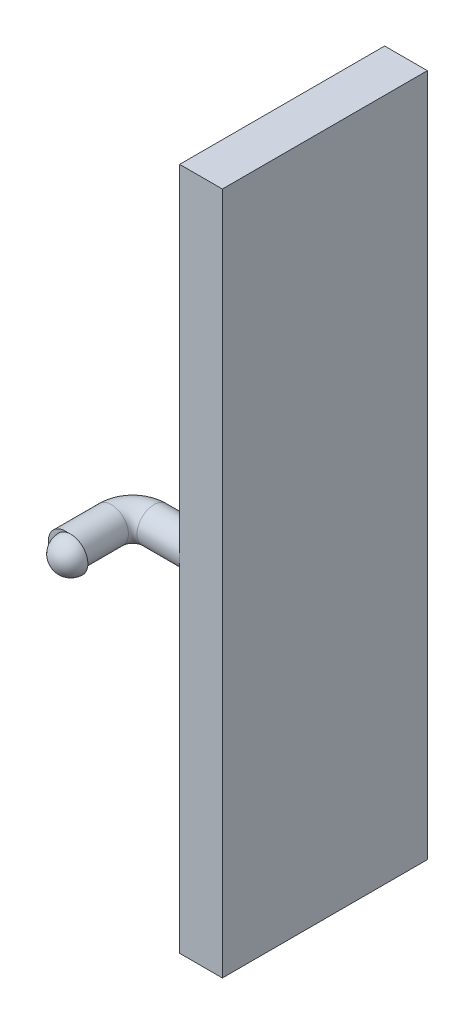
ISO-10303-21;
HEADER;
FILE_DESCRIPTION(('STEP AP214'),'2;1');
FILE_NAME('part.step','',(''),(''),'','','');
FILE_SCHEMA(('AUTOMOTIVE_DESIGN { 1 0 10303 214 1 1 1 1 }'));
ENDSEC;
DATA;
#1=APPLICATION_CONTEXT('core data for automotive mechanical design processes');
#2=APPLICATION_PROTOCOL_DEFINITION('international standard','automotive_design',2000,#1);
#3=PRODUCT_CONTEXT('',#1,'mechanical');
#4=PRODUCT('Part','Part','',(#3));
#5=PRODUCT_RELATED_PRODUCT_CATEGORY('part','',(#4));
#6=PRODUCT_DEFINITION_FORMATION('','',#4);
#7=PRODUCT_DEFINITION_CONTEXT('part definition',#1,'design');
#8=PRODUCT_DEFINITION('design','',#6,#7);
#9=PRODUCT_DEFINITION_SHAPE('','',#8);
#10=(LENGTH_UNIT() NAMED_UNIT(*) SI_UNIT(.MILLI.,.METRE.));
#11=(NAMED_UNIT(*) PLANE_ANGLE_UNIT() SI_UNIT($,.RADIAN.));
#12=(NAMED_UNIT(*) SI_UNIT($,.STERADIAN.) SOLID_ANGLE_UNIT());
#13=UNCERTAINTY_MEASURE_WITH_UNIT(LENGTH_MEASURE(1.E-05),#10,'distance_accuracy_value','');
#14=(GEOMETRIC_REPRESENTATION_CONTEXT(3) GLOBAL_UNCERTAINTY_ASSIGNED_CONTEXT((#13)) GLOBAL_UNIT_ASSIGNED_CONTEXT((#10,
#11,#12)) REPRESENTATION_CONTEXT('',''));
#15=CARTESIAN_POINT('',(0.,0.,0.));
#16=DIRECTION('',(0.,0.,1.));
#17=DIRECTION('',(1.,0.,0.));
#18=AXIS2_PLACEMENT_3D('',#15,#16,#17);
#19=CARTESIAN_POINT('',(-6.35,-50.8,2.53999999999999));
#20=DIRECTION('',(0.,0.,-1.));
#21=DIRECTION('',(-1.,0.,0.));
#22=AXIS2_PLACEMENT_3D('',#19,#20,#21);
#23=PLANE('',#22);
#24=DIRECTION('',(0.,1.,0.));
#25=VECTOR('',#24,1.);
#26=CARTESIAN_POINT('',(0.,-50.8,2.53999999999999));
#27=LINE('',#26,#25);
#28=CARTESIAN_POINT('',(0.,-50.8,2.53999999999999));
#29=VERTEX_POINT('',#28);
#30=CARTESIAN_POINT('',(0.,50.8,2.53999999999999));
#31=VERTEX_POINT('',#30);
#32=EDGE_CURVE('E123',#29,#31,#27,.T.);
#33=ORIENTED_EDGE('',*,*,#32,.T.);
#34=DIRECTION('',(1.,0.,0.));
#35=VECTOR('',#34,1.);
#36=CARTESIAN_POINT('',(-6.35,50.8,2.53999999999999));
#37=LINE('',#36,#35);
#38=CARTESIAN_POINT('',(-6.35,50.8,2.53999999999999));
#39=VERTEX_POINT('',#38);
#40=EDGE_CURVE('E50',#39,#31,#37,.T.);
#41=ORIENTED_EDGE('',*,*,#40,.F.);
#42=DIRECTION('',(0.,1.,0.));
#43=VECTOR('',#42,1.);
#44=CARTESIAN_POINT('',(-6.35,-50.8,2.53999999999999));
#45=LINE('',#44,#43);
#46=CARTESIAN_POINT('',(-6.35,0.,2.53999999999999));
#47=VERTEX_POINT('',#46);
#48=EDGE_CURVE('E131',#47,#39,#45,.T.);
#49=ORIENTED_EDGE('',*,*,#48,.F.);
#50=CARTESIAN_POINT('',(-6.35,-50.8,2.53999999999999));
#51=VERTEX_POINT('',#50);
#52=EDGE_CURVE('E132',#51,#47,#45,.T.);
#53=ORIENTED_EDGE('',*,*,#52,.F.);
#54=DIRECTION('',(1.,0.,0.));
#55=VECTOR('',#54,1.);
#56=CARTESIAN_POINT('',(-6.35,-50.8,2.53999999999999));
#57=LINE('',#56,#55);
#58=EDGE_CURVE('E11',#51,#29,#57,.T.);
#59=ORIENTED_EDGE('',*,*,#58,.T.);
#60=EDGE_LOOP('',(#33,#41,#49,#53,#59));
#61=FACE_BOUND('',#60,.T.);
#62=ADVANCED_FACE('F41',(#61),#23,.F.);
#63=CARTESIAN_POINT('',(-6.35,50.8,2.53999999999999));
#64=DIRECTION('',(0.,-1.,0.));
#65=DIRECTION('',(0.,0.,-1.));
#66=AXIS2_PLACEMENT_3D('',#63,#64,#65);
#67=PLANE('',#66);
#68=DIRECTION('',(0.,0.,-1.));
#69=VECTOR('',#68,1.);
#70=CARTESIAN_POINT('',(0.,50.8,2.53999999999999));
#71=LINE('',#70,#69);
#72=CARTESIAN_POINT('',(0.,50.8,-27.94));
#73=VERTEX_POINT('',#72);
#74=EDGE_CURVE('E140',#31,#73,#71,.T.);
#75=ORIENTED_EDGE('',*,*,#74,.T.);
#76=DIRECTION('',(1.,0.,0.));
#77=VECTOR('',#76,1.);
#78=CARTESIAN_POINT('',(-6.35,50.8,-27.94));
#79=LINE('',#78,#77);
#80=CARTESIAN_POINT('',(-6.35,50.8,-27.94));
#81=VERTEX_POINT('',#80);
#82=EDGE_CURVE('E144',#81,#73,#79,.T.);
#83=ORIENTED_EDGE('',*,*,#82,.F.);
#84=DIRECTION('',(0.,0.,-1.));
#85=VECTOR('',#84,1.);
#86=CARTESIAN_POINT('',(-6.35,50.8,-2.54000000000004));
#87=LINE('',#86,#85);
#88=EDGE_CURVE('E127',#39,#81,#87,.T.);
#89=ORIENTED_EDGE('',*,*,#88,.F.);
#90=ORIENTED_EDGE('',*,*,#40,.T.);
#91=EDGE_LOOP('',(#75,#83,#89,#90));
#92=FACE_BOUND('',#91,.T.);
#93=ADVANCED_FACE('F164',(#92),#67,.F.);
#94=CARTESIAN_POINT('',(-6.35,-50.8,-27.94));
#95=DIRECTION('',(0.,0.,-1.));
#96=DIRECTION('',(-1.,0.,0.));
#97=AXIS2_PLACEMENT_3D('',#94,#95,#96);
#98=PLANE('',#97);
#99=DIRECTION('',(0.,1.,0.));
#100=VECTOR('',#99,1.);
#101=CARTESIAN_POINT('',(0.,-50.8,-27.94));
#102=LINE('',#101,#100);
#103=CARTESIAN_POINT('',(0.,-50.8,-27.94));
#104=VERTEX_POINT('',#103);
#105=EDGE_CURVE('E137',#104,#73,#102,.T.);
#106=ORIENTED_EDGE('',*,*,#105,.F.);
#107=DIRECTION('',(1.,0.,0.));
#108=VECTOR('',#107,1.);
#109=CARTESIAN_POINT('',(-6.35,-50.8,-27.94));
#110=LINE('',#109,#108);
#111=CARTESIAN_POINT('',(-6.35,-50.8,-27.94));
#112=VERTEX_POINT('',#111);
#113=EDGE_CURVE('E45',#112,#104,#110,.T.);
#114=ORIENTED_EDGE('',*,*,#113,.F.);
#115=DIRECTION('',(0.,1.,0.));
#116=VECTOR('',#115,1.);
#117=CARTESIAN_POINT('',(-6.35,-50.8,-27.94));
#118=LINE('',#117,#116);
#119=CARTESIAN_POINT('',(-6.35,-1.90499999999997,-27.94));
#120=VERTEX_POINT('',#119);
#121=EDGE_CURVE('E124',#112,#120,#118,.T.);
#122=ORIENTED_EDGE('',*,*,#121,.T.);
#123=CARTESIAN_POINT('',(-6.35,1.90499999999997,-27.94));
#124=VERTEX_POINT('',#123);
#125=EDGE_CURVE('E128',#120,#124,#118,.T.);
#126=ORIENTED_EDGE('',*,*,#125,.T.);
#127=EDGE_CURVE('E122',#124,#81,#118,.T.);
#128=ORIENTED_EDGE('',*,*,#127,.T.);
#129=ORIENTED_EDGE('',*,*,#82,.T.);
#130=EDGE_LOOP('',(#106,#114,#122,#126,#128,#129));
#131=FACE_BOUND('',#130,.T.);
#132=ADVANCED_FACE('F153',(#131),#98,.T.);
#133=CARTESIAN_POINT('',(-6.35,-50.8,-2.54000000000004));
#134=DIRECTION('',(0.,-1.,0.));
#135=DIRECTION('',(0.,0.,-1.));
#136=AXIS2_PLACEMENT_3D('',#133,#134,#135);
#137=PLANE('',#136);
#138=DIRECTION('',(0.,0.,-1.));
#139=VECTOR('',#138,1.);
#140=CARTESIAN_POINT('',(0.,-50.8,-2.54000000000004));
#141=LINE('',#140,#139);
#142=EDGE_CURVE('E105',#29,#104,#141,.T.);
#143=ORIENTED_EDGE('',*,*,#142,.F.);
#144=ORIENTED_EDGE('',*,*,#58,.F.);
#145=DIRECTION('',(0.,0.,-1.));
#146=VECTOR('',#145,1.);
#147=CARTESIAN_POINT('',(-6.35,-50.8,2.53999999999999));
#148=LINE('',#147,#146);
#149=EDGE_CURVE('E120',#51,#112,#148,.T.);
#150=ORIENTED_EDGE('',*,*,#149,.T.);
#151=ORIENTED_EDGE('',*,*,#113,.T.);
#152=EDGE_LOOP('',(#143,#144,#150,#151));
#153=FACE_BOUND('',#152,.T.);
#154=ADVANCED_FACE('F43',(#153),#137,.T.);
#155=CARTESIAN_POINT('',(-6.35,0.,0.));
#156=DIRECTION('',(1.,0.,0.));
#157=DIRECTION('',(0.,0.,-1.));
#158=AXIS2_PLACEMENT_3D('',#155,#156,#157);
#159=PLANE('',#158);
#160=ORIENTED_EDGE('',*,*,#127,.F.);
#161=CARTESIAN_POINT('',(-6.35,0.,-25.4));
#162=DIRECTION('',(1.,0.,0.));
#163=DIRECTION('',(0.,0.,-1.));
#164=AXIS2_PLACEMENT_3D('',#161,#162,#163);
#165=CIRCLE('',#164,3.175);
#166=EDGE_CURVE('E172',#124,#120,#165,.T.);
#167=ORIENTED_EDGE('',*,*,#166,.T.);
#168=ORIENTED_EDGE('',*,*,#121,.F.);
#169=ORIENTED_EDGE('',*,*,#149,.F.);
#170=ORIENTED_EDGE('',*,*,#52,.T.);
#171=CARTESIAN_POINT('',(-6.35,0.,0.));
#172=DIRECTION('',(1.,0.,0.));
#173=DIRECTION('',(0.,0.,-1.));
#174=AXIS2_PLACEMENT_3D('',#171,#172,#173);
#175=CIRCLE('',#174,2.54);
#176=EDGE_CURVE('E171',#47,#47,#175,.T.);
#177=ORIENTED_EDGE('',*,*,#176,.T.);
#178=ORIENTED_EDGE('',*,*,#48,.T.);
#179=ORIENTED_EDGE('',*,*,#88,.T.);
#180=EDGE_LOOP('',(#160,#167,#168,#169,#170,#177,#178,#179));
#181=FACE_BOUND('',#180,.T.);
#182=ADVANCED_FACE('F167',(#181),#159,.F.);
#183=CARTESIAN_POINT('',(0.,0.,0.));
#184=DIRECTION('',(1.,0.,0.));
#185=DIRECTION('',(0.,0.,-1.));
#186=AXIS2_PLACEMENT_3D('',#183,#184,#185);
#187=PLANE('',#186);
#188=ORIENTED_EDGE('',*,*,#32,.F.);
#189=ORIENTED_EDGE('',*,*,#142,.T.);
#190=ORIENTED_EDGE('',*,*,#105,.T.);
#191=ORIENTED_EDGE('',*,*,#74,.F.);
#192=EDGE_LOOP('',(#188,#189,#190,#191));
#193=FACE_BOUND('',#192,.T.);
#194=ADVANCED_FACE('F157',(#193),#187,.T.);
#195=CARTESIAN_POINT('',(-15.875,0.,10.));
#196=DIRECTION('',(0.,0.,-1.));
#197=DIRECTION('',(-1.,0.,0.));
#198=AXIS2_PLACEMENT_3D('',#195,#196,#197);
#199=PLANE('',#198);
#200=CARTESIAN_POINT('',(-15.08,0.,10.));
#201=DIRECTION('',(0.,0.,1.));
#202=DIRECTION('',(1.,0.,0.));
#203=AXIS2_PLACEMENT_3D('',#200,#201,#202);
#204=CIRCLE('',#203,2.54);
#205=CARTESIAN_POINT('',(-15.4775,2.50870359947125,10.));
#206=VERTEX_POINT('',#205);
#207=CARTESIAN_POINT('',(-15.4775,-2.50870359947125,10.));
#208=VERTEX_POINT('',#207);
#209=EDGE_CURVE('E57',#206,#208,#204,.T.);
#210=ORIENTED_EDGE('',*,*,#209,.F.);
#211=CARTESIAN_POINT('',(-15.875,0.,10.));
#212=DIRECTION('',(0.,0.,-1.));
#213=DIRECTION('',(-1.,0.,0.));
#214=AXIS2_PLACEMENT_3D('',#211,#212,#213);
#215=CIRCLE('',#214,2.54);
#216=EDGE_CURVE('E106',#208,#206,#215,.T.);
#217=ORIENTED_EDGE('',*,*,#216,.F.);
#218=EDGE_LOOP('',(#210,#217));
#219=FACE_BOUND('',#218,.T.);
#220=ADVANCED_FACE('F111',(#219),#199,.F.);
#221=CARTESIAN_POINT('',(-6.35,0.,0.));
#222=DIRECTION('',(-1.,0.,0.));
#223=DIRECTION('',(0.,0.,1.));
#224=AXIS2_PLACEMENT_3D('',#221,#222,#223);
#225=CYLINDRICAL_SURFACE('',#224,2.54);
#226=CARTESIAN_POINT('',(-12.7,0.,0.));
#227=DIRECTION('',(1.,0.,0.));
#228=DIRECTION('',(0.,0.,-1.));
#229=AXIS2_PLACEMENT_3D('',#226,#227,#228);
#230=CIRCLE('',#229,2.54);
#231=CARTESIAN_POINT('',(-12.7,0.,-2.54));
#232=VERTEX_POINT('',#231);
#233=EDGE_CURVE('E116',#232,#232,#230,.T.);
#234=ORIENTED_EDGE('',*,*,#233,.T.);
#235=EDGE_LOOP('',(#234));
#236=FACE_BOUND('',#235,.T.);
#237=ORIENTED_EDGE('',*,*,#176,.F.);
#238=EDGE_LOOP('',(#237));
#239=FACE_BOUND('',#238,.T.);
#240=ADVANCED_FACE('F184',(#236,#239),#225,.T.);
#241=CARTESIAN_POINT('',(-12.7,0.,3.175));
#242=DIRECTION('',(0.,1.,0.));
#243=DIRECTION('',(0.,0.,1.));
#244=AXIS2_PLACEMENT_3D('',#241,#242,#243);
#245=TOROIDAL_SURFACE('',#244,3.175,2.54);
#246=CARTESIAN_POINT('',(-15.875,0.,3.175));
#247=DIRECTION('',(0.,0.,-1.));
#248=DIRECTION('',(-1.,0.,0.));
#249=AXIS2_PLACEMENT_3D('',#246,#247,#248);
#250=CIRCLE('',#249,2.54);
#251=CARTESIAN_POINT('',(-18.415,0.,3.175));
#252=VERTEX_POINT('',#251);
#253=EDGE_CURVE('E114',#252,#252,#250,.T.);
#254=CARTESIAN_POINT('',(-12.7,0.,3.175));
#255=DIRECTION('',(0.,1.,0.));
#256=DIRECTION('',(0.,0.,1.));
#257=AXIS2_PLACEMENT_3D('',#254,#255,#256);
#258=CIRCLE('',#257,5.715);
#259=EDGE_CURVE('',#232,#252,#258,.T.);
#260=ORIENTED_EDGE('',*,*,#233,.F.);
#261=ORIENTED_EDGE('',*,*,#253,.T.);
#262=ORIENTED_EDGE('',*,*,#259,.T.);
#263=ORIENTED_EDGE('',*,*,#259,.F.);
#264=EDGE_LOOP('',(#260,#262,#261,#263));
#265=FACE_BOUND('',#264,.T.);
#266=ADVANCED_FACE('F187',(#265),#245,.T.);
#267=CARTESIAN_POINT('',(-15.875,0.,3.175));
#268=DIRECTION('',(0.,0.,1.));
#269=DIRECTION('',(1.,0.,0.));
#270=AXIS2_PLACEMENT_3D('',#267,#268,#269);
#271=CYLINDRICAL_SURFACE('',#270,2.54);
#272=EDGE_CURVE('E99',#206,#208,#215,.T.);
#273=ORIENTED_EDGE('',*,*,#272,.T.);
#274=ORIENTED_EDGE('',*,*,#216,.T.);
#275=EDGE_LOOP('',(#273,#274));
#276=FACE_BOUND('',#275,.T.);
#277=ORIENTED_EDGE('',*,*,#253,.F.);
#278=EDGE_LOOP('',(#277));
#279=FACE_BOUND('',#278,.T.);
#280=ADVANCED_FACE('F112',(#276,#279),#271,.T.);
#281=CARTESIAN_POINT('',(-25.3302561210692,0.,-25.4));
#282=DIRECTION('',(1.,0.,0.));
#283=DIRECTION('',(0.,0.,-1.));
#284=AXIS2_PLACEMENT_3D('',#281,#282,#283);
#285=CYLINDRICAL_SURFACE('',#284,3.175);
#286=CARTESIAN_POINT('',(-16.35,0.,-25.4));
#287=DIRECTION('',(1.,0.,0.));
#288=DIRECTION('',(0.,0.,-1.));
#289=AXIS2_PLACEMENT_3D('',#286,#287,#288);
#290=CIRCLE('',#289,3.175);
#291=CARTESIAN_POINT('',(-16.35,0.,-28.575));
#292=VERTEX_POINT('',#291);
#293=EDGE_CURVE('E177',#292,#292,#290,.F.);
#294=ORIENTED_EDGE('',*,*,#293,.F.);
#295=EDGE_LOOP('',(#294));
#296=FACE_BOUND('',#295,.T.);
#297=ORIENTED_EDGE('',*,*,#166,.F.);
#298=EDGE_CURVE('E64',#120,#124,#165,.T.);
#299=ORIENTED_EDGE('',*,*,#298,.F.);
#300=EDGE_LOOP('',(#297,#299));
#301=FACE_BOUND('',#300,.T.);
#302=ADVANCED_FACE('F176',(#296,#301),#285,.T.);
#303=CARTESIAN_POINT('',(-6.35,0.,-25.4));
#304=DIRECTION('',(1.,0.,0.));
#305=DIRECTION('',(0.,0.,-1.));
#306=AXIS2_PLACEMENT_3D('',#303,#304,#305);
#307=PLANE('',#306);
#308=ORIENTED_EDGE('',*,*,#298,.T.);
#309=ORIENTED_EDGE('',*,*,#125,.F.);
#310=EDGE_LOOP('',(#308,#309));
#311=FACE_BOUND('',#310,.T.);
#312=ADVANCED_FACE('F174',(#311),#307,.T.);
#313=CARTESIAN_POINT('',(-15.08,0.,10.));
#314=DIRECTION('',(0.,0.,1.));
#315=DIRECTION('',(1.,0.,0.));
#316=AXIS2_PLACEMENT_3D('',#313,#314,#315);
#317=PLANE('',#316);
#318=EDGE_CURVE('E101',#208,#206,#204,.T.);
#319=ORIENTED_EDGE('',*,*,#318,.F.);
#320=ORIENTED_EDGE('',*,*,#272,.F.);
#321=EDGE_LOOP('',(#319,#320));
#322=FACE_BOUND('',#321,.T.);
#323=ADVANCED_FACE('F100',(#322),#317,.F.);
#324=CARTESIAN_POINT('',(-15.08,0.,10.));
#325=DIRECTION('',(0.,0.,1.));
#326=DIRECTION('',(-1.,0.,0.));
#327=AXIS2_PLACEMENT_3D('',#324,#325,#326);
#328=SPHERICAL_SURFACE('',#327,2.54);
#329=ORIENTED_EDGE('',*,*,#209,.T.);
#330=ORIENTED_EDGE('',*,*,#318,.T.);
#331=EDGE_LOOP('',(#329,#330));
#332=FACE_BOUND('',#331,.T.);
#333=ADVANCED_FACE('F108',(#332),#328,.T.);
#334=CARTESIAN_POINT('',(-16.35,0.,-25.4));
#335=DIRECTION('',(1.,0.,0.));
#336=DIRECTION('',(0.,0.,1.));
#337=AXIS2_PLACEMENT_3D('',#334,#335,#336);
#338=SPHERICAL_SURFACE('',#337,3.175);
#339=ORIENTED_EDGE('',*,*,#293,.T.);
#340=EDGE_LOOP('',(#339));
#341=FACE_BOUND('',#340,.T.);
#342=ADVANCED_FACE('F232',(#341),#338,.T.);
#343=CLOSED_SHELL('',(#62,#93,#132,#154,#182,#194,#220,#240,#266,#280,#302,#312,#323,#333,#342));
#344=MANIFOLD_SOLID_BREP('B2',#343);
#345=ADVANCED_BREP_SHAPE_REPRESENTATION('',(#18,#344),#14);
#346=SHAPE_DEFINITION_REPRESENTATION(#9,#345);
ENDSEC;
END-ISO-10303-21;
